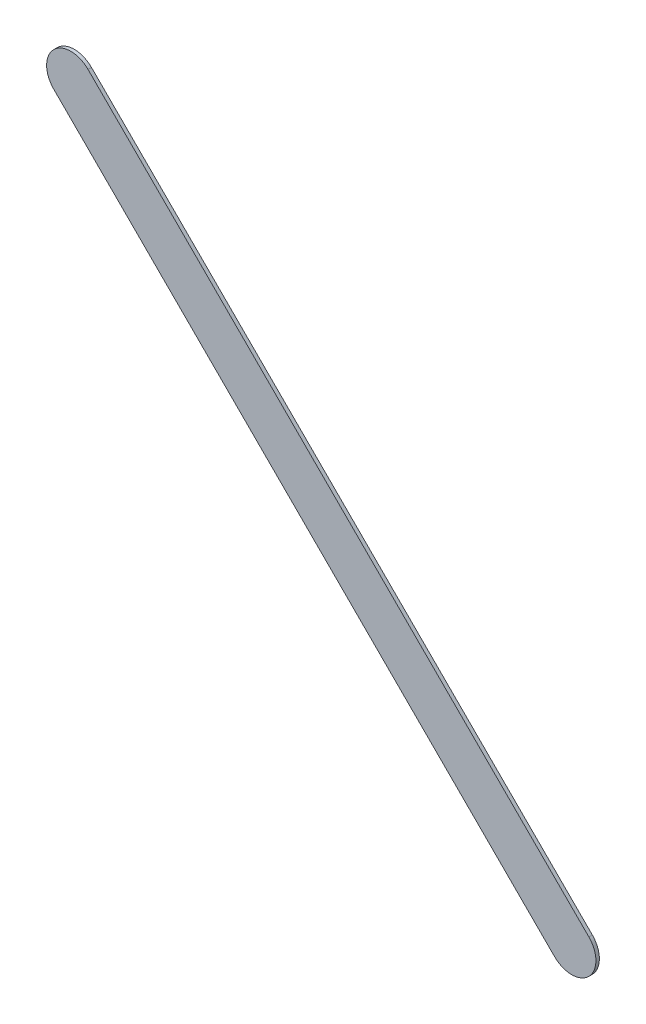
ISO-10303-21;
HEADER;
FILE_DESCRIPTION(('STEP AP214'),'2;1');
FILE_NAME('part.step','',(''),(''),'','','');
FILE_SCHEMA(('AUTOMOTIVE_DESIGN { 1 0 10303 214 1 1 1 1 }'));
ENDSEC;
DATA;
#1=APPLICATION_CONTEXT('core data for automotive mechanical design processes');
#2=APPLICATION_PROTOCOL_DEFINITION('international standard','automotive_design',2000,#1);
#3=PRODUCT_CONTEXT('',#1,'mechanical');
#4=PRODUCT('Part','Part','',(#3));
#5=PRODUCT_RELATED_PRODUCT_CATEGORY('part','',(#4));
#6=PRODUCT_DEFINITION_FORMATION('','',#4);
#7=PRODUCT_DEFINITION_CONTEXT('part definition',#1,'design');
#8=PRODUCT_DEFINITION('design','',#6,#7);
#9=PRODUCT_DEFINITION_SHAPE('','',#8);
#10=(LENGTH_UNIT() NAMED_UNIT(*) SI_UNIT(.MILLI.,.METRE.));
#11=(NAMED_UNIT(*) PLANE_ANGLE_UNIT() SI_UNIT($,.RADIAN.));
#12=(NAMED_UNIT(*) SI_UNIT($,.STERADIAN.) SOLID_ANGLE_UNIT());
#13=UNCERTAINTY_MEASURE_WITH_UNIT(LENGTH_MEASURE(1.E-05),#10,'distance_accuracy_value','');
#14=(GEOMETRIC_REPRESENTATION_CONTEXT(3) GLOBAL_UNCERTAINTY_ASSIGNED_CONTEXT((#13)) GLOBAL_UNIT_ASSIGNED_CONTEXT((#10,
#11,#12)) REPRESENTATION_CONTEXT('',''));
#15=CARTESIAN_POINT('',(0.,0.,0.));
#16=DIRECTION('',(0.,0.,1.));
#17=DIRECTION('',(1.,0.,0.));
#18=AXIS2_PLACEMENT_3D('',#15,#16,#17);
#19=CARTESIAN_POINT('',(94.30121348,95.24523496,0.));
#20=DIRECTION('',(0.707106781186548,0.707106781186548,0.));
#21=DIRECTION('',(0.707106781186548,-0.707106781186548,0.));
#22=AXIS2_PLACEMENT_3D('',#19,#20,#21);
#23=PLANE('',#22);
#24=DIRECTION('',(0.707106781186548,-0.707106781186548,0.));
#25=VECTOR('',#24,1.);
#26=CARTESIAN_POINT('',(94.30121348,95.24523496,0.03556));
#27=LINE('',#26,#25);
#28=CARTESIAN_POINT('',(94.30121348,95.24523496,0.03556));
#29=VERTEX_POINT('',#28);
#30=CARTESIAN_POINT('',(99.46922448,90.07722396,0.03556));
#31=VERTEX_POINT('',#30);
#32=EDGE_CURVE('E11',#29,#31,#27,.T.);
#33=ORIENTED_EDGE('',*,*,#32,.F.);
#34=DIRECTION('',(0.,0.,1.));
#35=VECTOR('',#34,1.);
#36=CARTESIAN_POINT('',(94.30121348,95.24523496,0.));
#37=LINE('',#36,#35);
#38=CARTESIAN_POINT('',(94.30121348,95.24523496,0.));
#39=VERTEX_POINT('',#38);
#40=EDGE_CURVE('E24',#39,#29,#37,.T.);
#41=ORIENTED_EDGE('',*,*,#40,.F.);
#42=DIRECTION('',(0.707106781186548,-0.707106781186548,0.));
#43=VECTOR('',#42,1.);
#44=CARTESIAN_POINT('',(94.30121348,95.24523496,0.));
#45=LINE('',#44,#43);
#46=CARTESIAN_POINT('',(99.46922448,90.07722396,0.));
#47=VERTEX_POINT('',#46);
#48=EDGE_CURVE('E75',#39,#47,#45,.T.);
#49=ORIENTED_EDGE('',*,*,#48,.T.);
#50=DIRECTION('',(0.,0.,1.));
#51=VECTOR('',#50,1.);
#52=CARTESIAN_POINT('',(99.46922448,90.07722396,0.));
#53=LINE('',#52,#51);
#54=EDGE_CURVE('E37',#47,#31,#53,.T.);
#55=ORIENTED_EDGE('',*,*,#54,.T.);
#56=EDGE_LOOP('',(#33,#41,#49,#55));
#57=FACE_BOUND('',#56,.T.);
#58=ADVANCED_FACE('F17',(#57),#23,.F.);
#59=CARTESIAN_POINT('',(99.64600086,90.25400034,0.));
#60=DIRECTION('',(0.,0.,-1.));
#61=DIRECTION('',(-0.707106781186548,-0.707106781186548,0.));
#62=AXIS2_PLACEMENT_3D('',#59,#60,#61);
#63=CYLINDRICAL_SURFACE('',#62,0.249999554103226);
#64=CARTESIAN_POINT('',(99.64600086,90.25400034,0.03556));
#65=DIRECTION('',(0.,0.,1.));
#66=DIRECTION('',(-0.707106781186548,-0.707106781186548,0.));
#67=AXIS2_PLACEMENT_3D('',#64,#65,#66);
#68=CIRCLE('',#67,0.249999554103226);
#69=CARTESIAN_POINT('',(99.82277724,90.43077672,0.03556));
#70=VERTEX_POINT('',#69);
#71=EDGE_CURVE('E83',#31,#70,#68,.T.);
#72=ORIENTED_EDGE('',*,*,#71,.F.);
#73=ORIENTED_EDGE('',*,*,#54,.F.);
#74=CARTESIAN_POINT('',(99.64600086,90.25400034,0.));
#75=DIRECTION('',(0.,0.,1.));
#76=DIRECTION('',(-0.707106781186548,-0.707106781186548,0.));
#77=AXIS2_PLACEMENT_3D('',#74,#75,#76);
#78=CIRCLE('',#77,0.249999554103226);
#79=CARTESIAN_POINT('',(99.82277724,90.43077672,0.));
#80=VERTEX_POINT('',#79);
#81=EDGE_CURVE('E81',#47,#80,#78,.T.);
#82=ORIENTED_EDGE('',*,*,#81,.T.);
#83=DIRECTION('',(0.,0.,1.));
#84=VECTOR('',#83,1.);
#85=CARTESIAN_POINT('',(99.82277724,90.43077672,0.));
#86=LINE('',#85,#84);
#87=EDGE_CURVE('E67',#80,#70,#86,.T.);
#88=ORIENTED_EDGE('',*,*,#87,.T.);
#89=EDGE_LOOP('',(#72,#73,#82,#88));
#90=FACE_BOUND('',#89,.T.);
#91=ADVANCED_FACE('F89',(#90),#63,.T.);
#92=CARTESIAN_POINT('',(99.82277724,90.43077672,0.));
#93=DIRECTION('',(-0.707106781186547,-0.707106781186549,0.));
#94=DIRECTION('',(-0.707106781186549,0.707106781186547,0.));
#95=AXIS2_PLACEMENT_3D('',#92,#93,#94);
#96=PLANE('',#95);
#97=DIRECTION('',(-0.707106781186549,0.707106781186547,0.));
#98=VECTOR('',#97,1.);
#99=CARTESIAN_POINT('',(99.82277724,90.43077672,0.03556));
#100=LINE('',#99,#98);
#101=CARTESIAN_POINT('',(94.65476624,95.59878772,0.03556));
#102=VERTEX_POINT('',#101);
#103=EDGE_CURVE('E71',#70,#102,#100,.T.);
#104=ORIENTED_EDGE('',*,*,#103,.F.);
#105=ORIENTED_EDGE('',*,*,#87,.F.);
#106=DIRECTION('',(-0.707106781186549,0.707106781186547,0.));
#107=VECTOR('',#106,1.);
#108=CARTESIAN_POINT('',(99.82277724,90.43077672,0.));
#109=LINE('',#108,#107);
#110=CARTESIAN_POINT('',(94.65476624,95.59878772,0.));
#111=VERTEX_POINT('',#110);
#112=EDGE_CURVE('E63',#80,#111,#109,.T.);
#113=ORIENTED_EDGE('',*,*,#112,.T.);
#114=DIRECTION('',(0.,0.,1.));
#115=VECTOR('',#114,1.);
#116=CARTESIAN_POINT('',(94.65476624,95.59878772,0.));
#117=LINE('',#116,#115);
#118=EDGE_CURVE('E53',#111,#102,#117,.T.);
#119=ORIENTED_EDGE('',*,*,#118,.T.);
#120=EDGE_LOOP('',(#104,#105,#113,#119));
#121=FACE_BOUND('',#120,.T.);
#122=ADVANCED_FACE('F66',(#121),#96,.F.);
#123=CARTESIAN_POINT('',(94.47798986,95.42201134,0.));
#124=DIRECTION('',(0.,0.,-1.));
#125=DIRECTION('',(0.707106781186519,0.707106781186576,0.));
#126=AXIS2_PLACEMENT_3D('',#123,#124,#125);
#127=CYLINDRICAL_SURFACE('',#126,0.24999955410322);
#128=CARTESIAN_POINT('',(94.47798986,95.42201134,0.03556));
#129=DIRECTION('',(0.,0.,1.));
#130=DIRECTION('',(0.707106781186519,0.707106781186576,0.));
#131=AXIS2_PLACEMENT_3D('',#128,#129,#130);
#132=CIRCLE('',#131,0.24999955410322);
#133=EDGE_CURVE('E59',#102,#29,#132,.T.);
#134=ORIENTED_EDGE('',*,*,#133,.F.);
#135=ORIENTED_EDGE('',*,*,#118,.F.);
#136=CARTESIAN_POINT('',(94.47798986,95.42201134,0.));
#137=DIRECTION('',(0.,0.,1.));
#138=DIRECTION('',(0.707106781186519,0.707106781186576,0.));
#139=AXIS2_PLACEMENT_3D('',#136,#137,#138);
#140=CIRCLE('',#139,0.24999955410322);
#141=EDGE_CURVE('E57',#111,#39,#140,.T.);
#142=ORIENTED_EDGE('',*,*,#141,.T.);
#143=ORIENTED_EDGE('',*,*,#40,.T.);
#144=EDGE_LOOP('',(#134,#135,#142,#143));
#145=FACE_BOUND('',#144,.T.);
#146=ADVANCED_FACE('F55',(#145),#127,.T.);
#147=CARTESIAN_POINT('',(94.30121348,95.24523496,0.));
#148=DIRECTION('',(0.,0.,-1.));
#149=DIRECTION('',(-1.,0.,0.));
#150=AXIS2_PLACEMENT_3D('',#147,#148,#149);
#151=PLANE('',#150);
#152=ORIENTED_EDGE('',*,*,#141,.F.);
#153=ORIENTED_EDGE('',*,*,#112,.F.);
#154=ORIENTED_EDGE('',*,*,#81,.F.);
#155=ORIENTED_EDGE('',*,*,#48,.F.);
#156=EDGE_LOOP('',(#152,#153,#154,#155));
#157=FACE_BOUND('',#156,.T.);
#158=ADVANCED_FACE('F74',(#157),#151,.T.);
#159=CARTESIAN_POINT('',(94.30121348,95.24523496,0.03556));
#160=DIRECTION('',(0.,0.,-1.));
#161=DIRECTION('',(-1.,0.,0.));
#162=AXIS2_PLACEMENT_3D('',#159,#160,#161);
#163=PLANE('',#162);
#164=ORIENTED_EDGE('',*,*,#32,.T.);
#165=ORIENTED_EDGE('',*,*,#71,.T.);
#166=ORIENTED_EDGE('',*,*,#103,.T.);
#167=ORIENTED_EDGE('',*,*,#133,.T.);
#168=EDGE_LOOP('',(#164,#165,#166,#167));
#169=FACE_BOUND('',#168,.T.);
#170=ADVANCED_FACE('F91',(#169),#163,.F.);
#171=CLOSED_SHELL('',(#58,#91,#122,#146,#158,#170));
#172=MANIFOLD_SOLID_BREP('B1',#171);
#173=ADVANCED_BREP_SHAPE_REPRESENTATION('',(#18,#172),#14);
#174=SHAPE_DEFINITION_REPRESENTATION(#9,#173);
ENDSEC;
END-ISO-10303-21;
